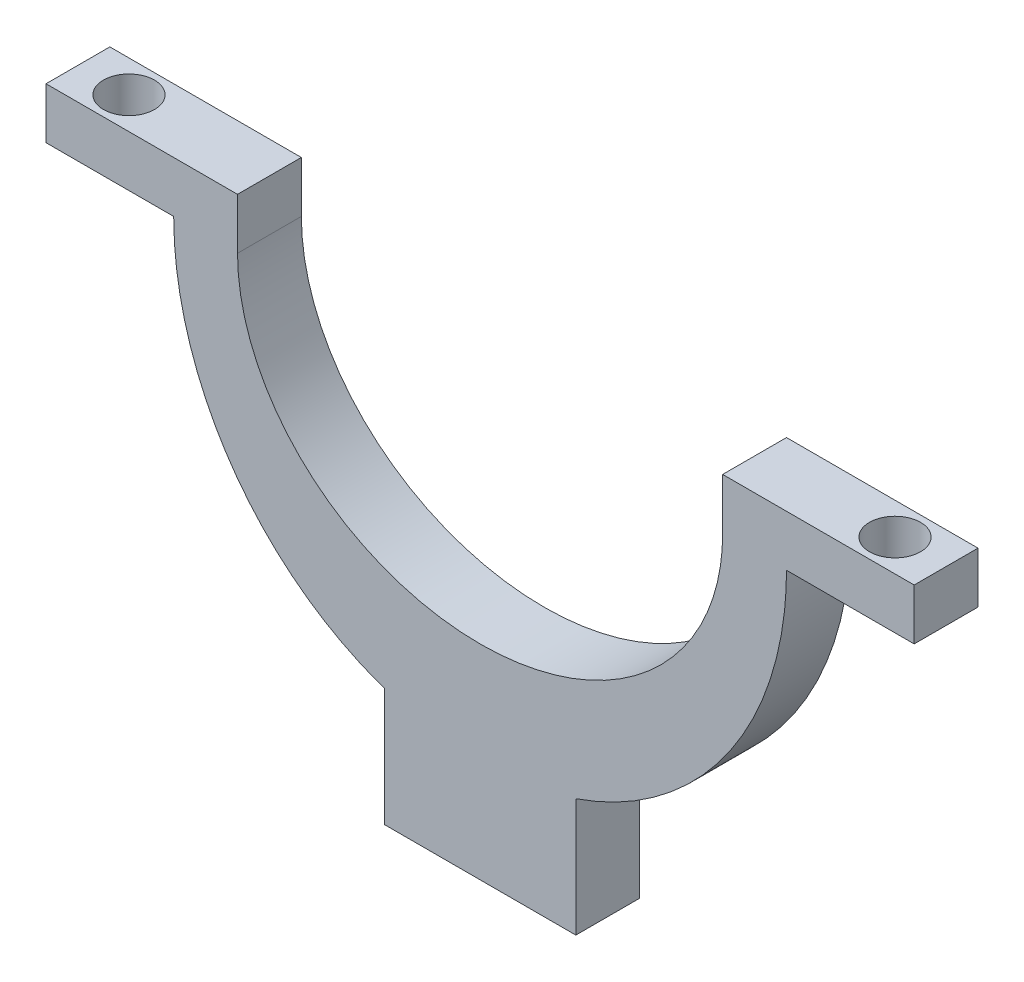
ISO-10303-21;
HEADER;
FILE_DESCRIPTION(('STEP AP214'),'2;1');
FILE_NAME('part.step','',(''),(''),'','','');
FILE_SCHEMA(('AUTOMOTIVE_DESIGN { 1 0 10303 214 1 1 1 1 }'));
ENDSEC;
DATA;
#1=APPLICATION_CONTEXT('core data for automotive mechanical design processes');
#2=APPLICATION_PROTOCOL_DEFINITION('international standard','automotive_design',2000,#1);
#3=PRODUCT_CONTEXT('',#1,'mechanical');
#4=PRODUCT('Part','Part','',(#3));
#5=PRODUCT_RELATED_PRODUCT_CATEGORY('part','',(#4));
#6=PRODUCT_DEFINITION_FORMATION('','',#4);
#7=PRODUCT_DEFINITION_CONTEXT('part definition',#1,'design');
#8=PRODUCT_DEFINITION('design','',#6,#7);
#9=PRODUCT_DEFINITION_SHAPE('','',#8);
#10=(LENGTH_UNIT() NAMED_UNIT(*) SI_UNIT(.MILLI.,.METRE.));
#11=(NAMED_UNIT(*) PLANE_ANGLE_UNIT() SI_UNIT($,.RADIAN.));
#12=(NAMED_UNIT(*) SI_UNIT($,.STERADIAN.) SOLID_ANGLE_UNIT());
#13=UNCERTAINTY_MEASURE_WITH_UNIT(LENGTH_MEASURE(1.E-05),#10,'distance_accuracy_value','');
#14=(GEOMETRIC_REPRESENTATION_CONTEXT(3) GLOBAL_UNCERTAINTY_ASSIGNED_CONTEXT((#13)) GLOBAL_UNIT_ASSIGNED_CONTEXT((#10,
#11,#12)) REPRESENTATION_CONTEXT('',''));
#15=CARTESIAN_POINT('',(0.,0.,0.));
#16=DIRECTION('',(0.,0.,1.));
#17=DIRECTION('',(1.,0.,0.));
#18=AXIS2_PLACEMENT_3D('',#15,#16,#17);
#19=CARTESIAN_POINT('',(0.,0.,5.));
#20=DIRECTION('',(0.,0.,1.));
#21=DIRECTION('',(0.,-1.,0.));
#22=AXIS2_PLACEMENT_3D('',#19,#20,#21);
#23=ELLIPSE('',#22,25.,24.);
#24=DIRECTION('',(0.,0.,-1.));
#25=VECTOR('',#24,1.);
#26=SURFACE_OF_LINEAR_EXTRUSION('',#23,#25);
#27=CARTESIAN_POINT('',(7.5,-23.7479439899542,5.));
#28=VERTEX_POINT('',#27);
#29=CARTESIAN_POINT('',(24.,0.,4.99999999999999));
#30=VERTEX_POINT('',#29);
#31=EDGE_CURVE('E64',#28,#30,#23,.T.);
#32=ORIENTED_EDGE('',*,*,#31,.F.);
#33=DIRECTION('',(0.,0.,-1.));
#34=VECTOR('',#33,1.);
#35=CARTESIAN_POINT('',(7.5,-23.7479439899542,5.));
#36=LINE('',#35,#34);
#37=CARTESIAN_POINT('',(7.5,-23.7479439899542,0.));
#38=VERTEX_POINT('',#37);
#39=EDGE_CURVE('E196',#28,#38,#36,.T.);
#40=ORIENTED_EDGE('',*,*,#39,.T.);
#41=CARTESIAN_POINT('',(0.,0.,0.));
#42=DIRECTION('',(0.,0.,1.));
#43=DIRECTION('',(0.,-1.,0.));
#44=AXIS2_PLACEMENT_3D('',#41,#42,#43);
#45=ELLIPSE('',#44,25.,24.);
#46=CARTESIAN_POINT('',(24.,0.,0.));
#47=VERTEX_POINT('',#46);
#48=EDGE_CURVE('E158',#38,#47,#45,.T.);
#49=ORIENTED_EDGE('',*,*,#48,.T.);
#50=DIRECTION('',(0.,0.,-1.));
#51=VECTOR('',#50,1.);
#52=CARTESIAN_POINT('',(24.,0.,5.));
#53=LINE('',#52,#51);
#54=EDGE_CURVE('E57',#30,#47,#53,.T.);
#55=ORIENTED_EDGE('',*,*,#54,.F.);
#56=EDGE_LOOP('',(#32,#40,#49,#55));
#57=FACE_BOUND('',#56,.T.);
#58=ADVANCED_FACE('F47',(#57),#26,.F.);
#59=CARTESIAN_POINT('',(-24.,0.,0.));
#60=VERTEX_POINT('',#59);
#61=CARTESIAN_POINT('',(-7.5,-23.7479439899542,0.));
#62=VERTEX_POINT('',#61);
#63=EDGE_CURVE('E298',#60,#62,#45,.T.);
#64=ORIENTED_EDGE('',*,*,#63,.T.);
#65=DIRECTION('',(0.,0.,-1.));
#66=VECTOR('',#65,1.);
#67=CARTESIAN_POINT('',(-7.5,-23.7479439899542,5.));
#68=LINE('',#67,#66);
#69=CARTESIAN_POINT('',(-7.5,-23.7479439899542,5.));
#70=VERTEX_POINT('',#69);
#71=EDGE_CURVE('E72',#62,#70,#68,.F.);
#72=ORIENTED_EDGE('',*,*,#71,.T.);
#73=CARTESIAN_POINT('',(-24.,0.,5.));
#74=VERTEX_POINT('',#73);
#75=EDGE_CURVE('E288',#74,#70,#23,.T.);
#76=ORIENTED_EDGE('',*,*,#75,.F.);
#77=DIRECTION('',(0.,0.,-1.));
#78=VECTOR('',#77,1.);
#79=CARTESIAN_POINT('',(-24.,0.,5.));
#80=LINE('',#79,#78);
#81=EDGE_CURVE('E11',#74,#60,#80,.T.);
#82=ORIENTED_EDGE('',*,*,#81,.T.);
#83=EDGE_LOOP('',(#64,#72,#76,#82));
#84=FACE_BOUND('',#83,.T.);
#85=ADVANCED_FACE('F49',(#84),#26,.F.);
#86=CARTESIAN_POINT('',(0.,0.,5.));
#87=DIRECTION('',(0.,0.,1.));
#88=DIRECTION('',(-1.,0.,0.));
#89=AXIS2_PLACEMENT_3D('',#86,#87,#88);
#90=ELLIPSE('',#89,19.,17.);
#91=DIRECTION('',(0.,0.,-1.));
#92=VECTOR('',#91,1.);
#93=SURFACE_OF_LINEAR_EXTRUSION('',#90,#92);
#94=CARTESIAN_POINT('',(0.,0.,0.));
#95=DIRECTION('',(0.,0.,1.));
#96=DIRECTION('',(-1.,0.,0.));
#97=AXIS2_PLACEMENT_3D('',#94,#95,#96);
#98=ELLIPSE('',#97,19.,17.);
#99=CARTESIAN_POINT('',(-19.,0.,0.));
#100=VERTEX_POINT('',#99);
#101=CARTESIAN_POINT('',(19.,0.,0.));
#102=VERTEX_POINT('',#101);
#103=EDGE_CURVE('E367',#100,#102,#98,.T.);
#104=ORIENTED_EDGE('',*,*,#103,.F.);
#105=DIRECTION('',(0.,0.,-1.));
#106=VECTOR('',#105,1.);
#107=CARTESIAN_POINT('',(-19.,0.,5.));
#108=LINE('',#107,#106);
#109=CARTESIAN_POINT('',(-19.,0.,5.));
#110=VERTEX_POINT('',#109);
#111=EDGE_CURVE('E297',#110,#100,#108,.T.);
#112=ORIENTED_EDGE('',*,*,#111,.F.);
#113=CARTESIAN_POINT('',(19.,0.,4.99999999999999));
#114=VERTEX_POINT('',#113);
#115=EDGE_CURVE('E292',#110,#114,#90,.T.);
#116=ORIENTED_EDGE('',*,*,#115,.T.);
#117=DIRECTION('',(0.,0.,-1.));
#118=VECTOR('',#117,1.);
#119=CARTESIAN_POINT('',(19.,0.,5.));
#120=LINE('',#119,#118);
#121=EDGE_CURVE('E386',#114,#102,#120,.T.);
#122=ORIENTED_EDGE('',*,*,#121,.T.);
#123=EDGE_LOOP('',(#104,#112,#116,#122));
#124=FACE_BOUND('',#123,.T.);
#125=ADVANCED_FACE('F300',(#124),#93,.T.);
#126=CARTESIAN_POINT('',(0.,0.,5.));
#127=DIRECTION('',(0.,0.,1.));
#128=DIRECTION('',(1.,0.,0.));
#129=AXIS2_PLACEMENT_3D('',#126,#127,#128);
#130=PLANE('',#129);
#131=ORIENTED_EDGE('',*,*,#75,.T.);
#132=DIRECTION('',(0.,1.,0.));
#133=VECTOR('',#132,1.);
#134=CARTESIAN_POINT('',(-7.5,-33.,5.));
#135=LINE('',#134,#133);
#136=CARTESIAN_POINT('',(-7.5,-33.,5.));
#137=VERTEX_POINT('',#136);
#138=EDGE_CURVE('E188',#137,#70,#135,.T.);
#139=ORIENTED_EDGE('',*,*,#138,.F.);
#140=DIRECTION('',(1.,0.,0.));
#141=VECTOR('',#140,1.);
#142=CARTESIAN_POINT('',(-7.5,-33.,5.));
#143=LINE('',#142,#141);
#144=CARTESIAN_POINT('',(7.5,-33.,5.));
#145=VERTEX_POINT('',#144);
#146=EDGE_CURVE('E163',#137,#145,#143,.T.);
#147=ORIENTED_EDGE('',*,*,#146,.T.);
#148=DIRECTION('',(0.,1.,0.));
#149=VECTOR('',#148,1.);
#150=CARTESIAN_POINT('',(7.5,-33.,5.));
#151=LINE('',#150,#149);
#152=EDGE_CURVE('E178',#145,#28,#151,.T.);
#153=ORIENTED_EDGE('',*,*,#152,.T.);
#154=ORIENTED_EDGE('',*,*,#31,.T.);
#155=DIRECTION('',(1.,0.,0.));
#156=VECTOR('',#155,1.);
#157=CARTESIAN_POINT('',(19.,0.,4.99999999999999));
#158=LINE('',#157,#156);
#159=CARTESIAN_POINT('',(34.,0.,4.99999999999999));
#160=VERTEX_POINT('',#159);
#161=EDGE_CURVE('E235',#30,#160,#158,.T.);
#162=ORIENTED_EDGE('',*,*,#161,.T.);
#163=DIRECTION('',(0.,-1.,0.));
#164=VECTOR('',#163,1.);
#165=CARTESIAN_POINT('',(34.,4.,4.99999999999999));
#166=LINE('',#165,#164);
#167=CARTESIAN_POINT('',(34.,4.,4.99999999999999));
#168=VERTEX_POINT('',#167);
#169=EDGE_CURVE('E257',#168,#160,#166,.T.);
#170=ORIENTED_EDGE('',*,*,#169,.F.);
#171=DIRECTION('',(1.,0.,0.));
#172=VECTOR('',#171,1.);
#173=CARTESIAN_POINT('',(19.,4.,4.99999999999999));
#174=LINE('',#173,#172);
#175=CARTESIAN_POINT('',(19.,4.,4.99999999999999));
#176=VERTEX_POINT('',#175);
#177=EDGE_CURVE('E283',#176,#168,#174,.T.);
#178=ORIENTED_EDGE('',*,*,#177,.F.);
#179=DIRECTION('',(0.,-1.,0.));
#180=VECTOR('',#179,1.);
#181=CARTESIAN_POINT('',(19.,4.,4.99999999999999));
#182=LINE('',#181,#180);
#183=EDGE_CURVE('E215',#176,#114,#182,.T.);
#184=ORIENTED_EDGE('',*,*,#183,.T.);
#185=ORIENTED_EDGE('',*,*,#115,.F.);
#186=DIRECTION('',(0.,-1.,0.));
#187=VECTOR('',#186,1.);
#188=CARTESIAN_POINT('',(-19.,4.,5.));
#189=LINE('',#188,#187);
#190=CARTESIAN_POINT('',(-19.,4.,5.));
#191=VERTEX_POINT('',#190);
#192=EDGE_CURVE('E230',#191,#110,#189,.T.);
#193=ORIENTED_EDGE('',*,*,#192,.F.);
#194=DIRECTION('',(1.,0.,0.));
#195=VECTOR('',#194,1.);
#196=CARTESIAN_POINT('',(-19.,4.,5.));
#197=LINE('',#196,#195);
#198=CARTESIAN_POINT('',(-34.,4.,5.));
#199=VERTEX_POINT('',#198);
#200=EDGE_CURVE('E227',#199,#191,#197,.T.);
#201=ORIENTED_EDGE('',*,*,#200,.F.);
#202=DIRECTION('',(0.,-1.,0.));
#203=VECTOR('',#202,1.);
#204=CARTESIAN_POINT('',(-34.,4.,5.));
#205=LINE('',#204,#203);
#206=CARTESIAN_POINT('',(-34.,0.,5.));
#207=VERTEX_POINT('',#206);
#208=EDGE_CURVE('E243',#199,#207,#205,.T.);
#209=ORIENTED_EDGE('',*,*,#208,.T.);
#210=DIRECTION('',(1.,0.,0.));
#211=VECTOR('',#210,1.);
#212=CARTESIAN_POINT('',(-19.,0.,5.));
#213=LINE('',#212,#211);
#214=EDGE_CURVE('E221',#207,#74,#213,.T.);
#215=ORIENTED_EDGE('',*,*,#214,.T.);
#216=EDGE_LOOP('',(#131,#139,#147,#153,#154,#162,#170,#178,#184,#185,#193,#201,#209,#215));
#217=FACE_BOUND('',#216,.T.);
#218=ADVANCED_FACE('F303',(#217),#130,.T.);
#219=CARTESIAN_POINT('',(0.,0.,0.));
#220=DIRECTION('',(0.,0.,1.));
#221=DIRECTION('',(1.,0.,0.));
#222=AXIS2_PLACEMENT_3D('',#219,#220,#221);
#223=PLANE('',#222);
#224=ORIENTED_EDGE('',*,*,#48,.F.);
#225=DIRECTION('',(0.,1.,0.));
#226=VECTOR('',#225,1.);
#227=CARTESIAN_POINT('',(7.5,-33.,0.));
#228=LINE('',#227,#226);
#229=CARTESIAN_POINT('',(7.5,-33.,0.));
#230=VERTEX_POINT('',#229);
#231=EDGE_CURVE('E152',#230,#38,#228,.T.);
#232=ORIENTED_EDGE('',*,*,#231,.F.);
#233=DIRECTION('',(-1.,0.,0.));
#234=VECTOR('',#233,1.);
#235=CARTESIAN_POINT('',(-7.5,-33.,0.));
#236=LINE('',#235,#234);
#237=CARTESIAN_POINT('',(-7.5,-33.,0.));
#238=VERTEX_POINT('',#237);
#239=EDGE_CURVE('E156',#230,#238,#236,.T.);
#240=ORIENTED_EDGE('',*,*,#239,.T.);
#241=DIRECTION('',(0.,1.,0.));
#242=VECTOR('',#241,1.);
#243=CARTESIAN_POINT('',(-7.5,-33.,0.));
#244=LINE('',#243,#242);
#245=EDGE_CURVE('E162',#238,#62,#244,.T.);
#246=ORIENTED_EDGE('',*,*,#245,.T.);
#247=ORIENTED_EDGE('',*,*,#63,.F.);
#248=DIRECTION('',(-1.,0.,0.));
#249=VECTOR('',#248,1.);
#250=CARTESIAN_POINT('',(-19.,0.,0.));
#251=LINE('',#250,#249);
#252=CARTESIAN_POINT('',(-34.,0.,0.));
#253=VERTEX_POINT('',#252);
#254=EDGE_CURVE('E231',#60,#253,#251,.T.);
#255=ORIENTED_EDGE('',*,*,#254,.T.);
#256=DIRECTION('',(0.,-1.,0.));
#257=VECTOR('',#256,1.);
#258=CARTESIAN_POINT('',(-34.,4.,0.));
#259=LINE('',#258,#257);
#260=CARTESIAN_POINT('',(-34.,4.,0.));
#261=VERTEX_POINT('',#260);
#262=EDGE_CURVE('E247',#261,#253,#259,.T.);
#263=ORIENTED_EDGE('',*,*,#262,.F.);
#264=DIRECTION('',(-1.,0.,0.));
#265=VECTOR('',#264,1.);
#266=CARTESIAN_POINT('',(-19.,4.,0.));
#267=LINE('',#266,#265);
#268=CARTESIAN_POINT('',(-19.,4.,0.));
#269=VERTEX_POINT('',#268);
#270=EDGE_CURVE('E220',#269,#261,#267,.T.);
#271=ORIENTED_EDGE('',*,*,#270,.F.);
#272=DIRECTION('',(0.,-1.,0.));
#273=VECTOR('',#272,1.);
#274=CARTESIAN_POINT('',(-19.,4.,0.));
#275=LINE('',#274,#273);
#276=EDGE_CURVE('E251',#269,#100,#275,.T.);
#277=ORIENTED_EDGE('',*,*,#276,.T.);
#278=ORIENTED_EDGE('',*,*,#103,.T.);
#279=DIRECTION('',(0.,-1.,0.));
#280=VECTOR('',#279,1.);
#281=CARTESIAN_POINT('',(19.,4.,0.));
#282=LINE('',#281,#280);
#283=CARTESIAN_POINT('',(19.,4.,0.));
#284=VERTEX_POINT('',#283);
#285=EDGE_CURVE('E265',#284,#102,#282,.T.);
#286=ORIENTED_EDGE('',*,*,#285,.F.);
#287=DIRECTION('',(-1.,0.,0.));
#288=VECTOR('',#287,1.);
#289=CARTESIAN_POINT('',(19.,4.,0.));
#290=LINE('',#289,#288);
#291=CARTESIAN_POINT('',(34.,4.,0.));
#292=VERTEX_POINT('',#291);
#293=EDGE_CURVE('E268',#292,#284,#290,.T.);
#294=ORIENTED_EDGE('',*,*,#293,.F.);
#295=DIRECTION('',(0.,-1.,0.));
#296=VECTOR('',#295,1.);
#297=CARTESIAN_POINT('',(34.,4.,0.));
#298=LINE('',#297,#296);
#299=CARTESIAN_POINT('',(34.,0.,0.));
#300=VERTEX_POINT('',#299);
#301=EDGE_CURVE('E261',#292,#300,#298,.T.);
#302=ORIENTED_EDGE('',*,*,#301,.T.);
#303=DIRECTION('',(-1.,0.,0.));
#304=VECTOR('',#303,1.);
#305=CARTESIAN_POINT('',(19.,0.,0.));
#306=LINE('',#305,#304);
#307=EDGE_CURVE('E269',#300,#47,#306,.T.);
#308=ORIENTED_EDGE('',*,*,#307,.T.);
#309=EDGE_LOOP('',(#224,#232,#240,#246,#247,#255,#263,#271,#277,#278,#286,#294,#302,#308));
#310=FACE_BOUND('',#309,.T.);
#311=ADVANCED_FACE('F154',(#310),#223,.F.);
#312=CARTESIAN_POINT('',(0.,0.,0.));
#313=DIRECTION('',(0.,1.,0.));
#314=DIRECTION('',(0.,0.,1.));
#315=AXIS2_PLACEMENT_3D('',#312,#313,#314);
#316=PLANE('',#315);
#317=CARTESIAN_POINT('',(30.,0.,2.49999999999999));
#318=DIRECTION('',(0.,1.,0.));
#319=DIRECTION('',(0.,0.,1.));
#320=AXIS2_PLACEMENT_3D('',#317,#318,#319);
#321=CIRCLE('',#320,2.);
#322=CARTESIAN_POINT('',(30.,0.,4.49999999999999));
#323=VERTEX_POINT('',#322);
#324=EDGE_CURVE('E211',#323,#323,#321,.T.);
#325=ORIENTED_EDGE('',*,*,#324,.T.);
#326=EDGE_LOOP('',(#325));
#327=FACE_BOUND('',#326,.T.);
#328=ORIENTED_EDGE('',*,*,#161,.F.);
#329=ORIENTED_EDGE('',*,*,#54,.T.);
#330=ORIENTED_EDGE('',*,*,#307,.F.);
#331=DIRECTION('',(0.,0.,-1.));
#332=VECTOR('',#331,1.);
#333=CARTESIAN_POINT('',(34.,0.,0.));
#334=LINE('',#333,#332);
#335=EDGE_CURVE('E272',#160,#300,#334,.T.);
#336=ORIENTED_EDGE('',*,*,#335,.F.);
#337=EDGE_LOOP('',(#328,#329,#330,#336));
#338=FACE_BOUND('',#337,.T.);
#339=ADVANCED_FACE('F307',(#327,#338),#316,.F.);
#340=CARTESIAN_POINT('',(19.,4.,0.));
#341=DIRECTION('',(1.,0.,0.));
#342=DIRECTION('',(0.,0.,-1.));
#343=AXIS2_PLACEMENT_3D('',#340,#341,#342);
#344=PLANE('',#343);
#345=ORIENTED_EDGE('',*,*,#121,.F.);
#346=ORIENTED_EDGE('',*,*,#183,.F.);
#347=DIRECTION('',(0.,0.,1.));
#348=VECTOR('',#347,1.);
#349=CARTESIAN_POINT('',(19.,4.,0.));
#350=LINE('',#349,#348);
#351=EDGE_CURVE('E273',#284,#176,#350,.T.);
#352=ORIENTED_EDGE('',*,*,#351,.F.);
#353=ORIENTED_EDGE('',*,*,#285,.T.);
#354=EDGE_LOOP('',(#345,#346,#352,#353));
#355=FACE_BOUND('',#354,.T.);
#356=ADVANCED_FACE('F319',(#355),#344,.F.);
#357=CARTESIAN_POINT('',(34.,4.,0.));
#358=DIRECTION('',(-1.,0.,0.));
#359=DIRECTION('',(0.,0.,1.));
#360=AXIS2_PLACEMENT_3D('',#357,#358,#359);
#361=PLANE('',#360);
#362=ORIENTED_EDGE('',*,*,#335,.T.);
#363=ORIENTED_EDGE('',*,*,#301,.F.);
#364=DIRECTION('',(0.,0.,-1.));
#365=VECTOR('',#364,1.);
#366=CARTESIAN_POINT('',(34.,4.,0.));
#367=LINE('',#366,#365);
#368=EDGE_CURVE('E280',#168,#292,#367,.T.);
#369=ORIENTED_EDGE('',*,*,#368,.F.);
#370=ORIENTED_EDGE('',*,*,#169,.T.);
#371=EDGE_LOOP('',(#362,#363,#369,#370));
#372=FACE_BOUND('',#371,.T.);
#373=ADVANCED_FACE('F315',(#372),#361,.F.);
#374=CARTESIAN_POINT('',(0.,4.,0.));
#375=DIRECTION('',(0.,1.,0.));
#376=DIRECTION('',(0.,0.,1.));
#377=AXIS2_PLACEMENT_3D('',#374,#375,#376);
#378=PLANE('',#377);
#379=CARTESIAN_POINT('',(30.,4.,2.49999999999999));
#380=DIRECTION('',(0.,1.,0.));
#381=DIRECTION('',(0.,0.,-1.));
#382=AXIS2_PLACEMENT_3D('',#379,#380,#381);
#383=CIRCLE('',#382,2.);
#384=CARTESIAN_POINT('',(30.,4.,4.49999999999999));
#385=VERTEX_POINT('',#384);
#386=EDGE_CURVE('E199',#385,#385,#383,.T.);
#387=ORIENTED_EDGE('',*,*,#386,.F.);
#388=EDGE_LOOP('',(#387));
#389=FACE_BOUND('',#388,.T.);
#390=ORIENTED_EDGE('',*,*,#351,.T.);
#391=ORIENTED_EDGE('',*,*,#177,.T.);
#392=ORIENTED_EDGE('',*,*,#368,.T.);
#393=ORIENTED_EDGE('',*,*,#293,.T.);
#394=EDGE_LOOP('',(#390,#391,#392,#393));
#395=FACE_BOUND('',#394,.T.);
#396=ADVANCED_FACE('F311',(#389,#395),#378,.T.);
#397=CARTESIAN_POINT('',(0.,0.,0.));
#398=DIRECTION('',(0.,-1.,0.));
#399=DIRECTION('',(0.,0.,-1.));
#400=AXIS2_PLACEMENT_3D('',#397,#398,#399);
#401=PLANE('',#400);
#402=CARTESIAN_POINT('',(-30.,0.,2.5));
#403=DIRECTION('',(0.,-1.,0.));
#404=DIRECTION('',(0.,0.,-1.));
#405=AXIS2_PLACEMENT_3D('',#402,#403,#404);
#406=CIRCLE('',#405,2.);
#407=CARTESIAN_POINT('',(-30.,0.,4.5));
#408=VERTEX_POINT('',#407);
#409=EDGE_CURVE('E204',#408,#408,#406,.T.);
#410=ORIENTED_EDGE('',*,*,#409,.F.);
#411=EDGE_LOOP('',(#410));
#412=FACE_BOUND('',#411,.T.);
#413=ORIENTED_EDGE('',*,*,#81,.F.);
#414=ORIENTED_EDGE('',*,*,#214,.F.);
#415=DIRECTION('',(0.,0.,1.));
#416=VECTOR('',#415,1.);
#417=CARTESIAN_POINT('',(-34.,0.,0.));
#418=LINE('',#417,#416);
#419=EDGE_CURVE('E234',#253,#207,#418,.T.);
#420=ORIENTED_EDGE('',*,*,#419,.F.);
#421=ORIENTED_EDGE('',*,*,#254,.F.);
#422=EDGE_LOOP('',(#413,#414,#420,#421));
#423=FACE_BOUND('',#422,.T.);
#424=ADVANCED_FACE('F314',(#412,#423),#401,.T.);
#425=CARTESIAN_POINT('',(-19.,4.,0.));
#426=DIRECTION('',(-1.,0.,0.));
#427=DIRECTION('',(0.,0.,1.));
#428=AXIS2_PLACEMENT_3D('',#425,#426,#427);
#429=PLANE('',#428);
#430=ORIENTED_EDGE('',*,*,#111,.T.);
#431=ORIENTED_EDGE('',*,*,#276,.F.);
#432=DIRECTION('',(0.,0.,-1.));
#433=VECTOR('',#432,1.);
#434=CARTESIAN_POINT('',(-19.,4.,0.));
#435=LINE('',#434,#433);
#436=EDGE_CURVE('E216',#191,#269,#435,.T.);
#437=ORIENTED_EDGE('',*,*,#436,.F.);
#438=ORIENTED_EDGE('',*,*,#192,.T.);
#439=EDGE_LOOP('',(#430,#431,#437,#438));
#440=FACE_BOUND('',#439,.T.);
#441=ADVANCED_FACE('F327',(#440),#429,.F.);
#442=CARTESIAN_POINT('',(-34.,4.,0.));
#443=DIRECTION('',(1.,0.,0.));
#444=DIRECTION('',(0.,0.,-1.));
#445=AXIS2_PLACEMENT_3D('',#442,#443,#444);
#446=PLANE('',#445);
#447=ORIENTED_EDGE('',*,*,#419,.T.);
#448=ORIENTED_EDGE('',*,*,#208,.F.);
#449=DIRECTION('',(0.,0.,1.));
#450=VECTOR('',#449,1.);
#451=CARTESIAN_POINT('',(-34.,4.,0.));
#452=LINE('',#451,#450);
#453=EDGE_CURVE('E224',#261,#199,#452,.T.);
#454=ORIENTED_EDGE('',*,*,#453,.F.);
#455=ORIENTED_EDGE('',*,*,#262,.T.);
#456=EDGE_LOOP('',(#447,#448,#454,#455));
#457=FACE_BOUND('',#456,.T.);
#458=ADVANCED_FACE('F330',(#457),#446,.F.);
#459=CARTESIAN_POINT('',(0.,4.,0.));
#460=DIRECTION('',(0.,-1.,0.));
#461=DIRECTION('',(0.,0.,-1.));
#462=AXIS2_PLACEMENT_3D('',#459,#460,#461);
#463=PLANE('',#462);
#464=CARTESIAN_POINT('',(-30.,4.,2.5));
#465=DIRECTION('',(0.,1.,0.));
#466=DIRECTION('',(0.,0.,1.));
#467=AXIS2_PLACEMENT_3D('',#464,#465,#466);
#468=CIRCLE('',#467,2.);
#469=CARTESIAN_POINT('',(-30.,4.,4.5));
#470=VERTEX_POINT('',#469);
#471=EDGE_CURVE('E200',#470,#470,#468,.T.);
#472=ORIENTED_EDGE('',*,*,#471,.F.);
#473=EDGE_LOOP('',(#472));
#474=FACE_BOUND('',#473,.T.);
#475=ORIENTED_EDGE('',*,*,#436,.T.);
#476=ORIENTED_EDGE('',*,*,#270,.T.);
#477=ORIENTED_EDGE('',*,*,#453,.T.);
#478=ORIENTED_EDGE('',*,*,#200,.T.);
#479=EDGE_LOOP('',(#475,#476,#477,#478));
#480=FACE_BOUND('',#479,.T.);
#481=ADVANCED_FACE('F334',(#474,#480),#463,.F.);
#482=CARTESIAN_POINT('',(-30.,-25.,2.5));
#483=DIRECTION('',(0.,1.,0.));
#484=DIRECTION('',(0.,0.,1.));
#485=AXIS2_PLACEMENT_3D('',#482,#483,#484);
#486=CYLINDRICAL_SURFACE('',#485,2.);
#487=CARTESIAN_POINT('',(-30.,0.,4.5));
#488=CARTESIAN_POINT('',(-30.,0.0416666666666701,4.5));
#489=CARTESIAN_POINT('',(-30.,0.0833333333333369,4.5));
#490=CARTESIAN_POINT('',(-30.,0.16666666666667,4.5));
#491=CARTESIAN_POINT('',(-30.,0.208333333333337,4.5));
#492=CARTESIAN_POINT('',(-30.,0.29166666666667,4.5));
#493=CARTESIAN_POINT('',(-30.,0.333333333333337,4.5));
#494=CARTESIAN_POINT('',(-30.,0.416666666666671,4.5));
#495=CARTESIAN_POINT('',(-30.,0.458333333333337,4.5));
#496=CARTESIAN_POINT('',(-30.,0.541666666666671,4.5));
#497=CARTESIAN_POINT('',(-30.,0.583333333333337,4.5));
#498=CARTESIAN_POINT('',(-30.,0.666666666666671,4.5));
#499=CARTESIAN_POINT('',(-30.,0.708333333333337,4.5));
#500=CARTESIAN_POINT('',(-30.,0.791666666666671,4.5));
#501=CARTESIAN_POINT('',(-30.,0.833333333333337,4.5));
#502=CARTESIAN_POINT('',(-30.,0.916666666666671,4.5));
#503=CARTESIAN_POINT('',(-30.,0.958333333333338,4.5));
#504=CARTESIAN_POINT('',(-30.,1.04166666666667,4.5));
#505=CARTESIAN_POINT('',(-30.,1.08333333333334,4.5));
#506=CARTESIAN_POINT('',(-30.,1.16666666666667,4.5));
#507=CARTESIAN_POINT('',(-30.,1.20833333333333,4.5));
#508=CARTESIAN_POINT('',(-30.,1.29166666666667,4.5));
#509=CARTESIAN_POINT('',(-30.,1.33333333333333,4.5));
#510=CARTESIAN_POINT('',(-30.,1.41666666666667,4.5));
#511=CARTESIAN_POINT('',(-30.,1.45833333333333,4.5));
#512=CARTESIAN_POINT('',(-30.,1.54166666666667,4.5));
#513=CARTESIAN_POINT('',(-30.,1.58333333333333,4.5));
#514=CARTESIAN_POINT('',(-30.,1.66666666666667,4.5));
#515=CARTESIAN_POINT('',(-30.,1.70833333333333,4.5));
#516=CARTESIAN_POINT('',(-30.,1.79166666666667,4.5));
#517=CARTESIAN_POINT('',(-30.,1.83333333333334,4.5));
#518=CARTESIAN_POINT('',(-30.,1.91666666666667,4.5));
#519=CARTESIAN_POINT('',(-30.,1.95833333333334,4.5));
#520=CARTESIAN_POINT('',(-30.,2.04166666666667,4.5));
#521=CARTESIAN_POINT('',(-30.,2.08333333333334,4.5));
#522=CARTESIAN_POINT('',(-30.,2.16666666666667,4.5));
#523=CARTESIAN_POINT('',(-30.,2.20833333333334,4.5));
#524=CARTESIAN_POINT('',(-30.,2.29166666666667,4.5));
#525=CARTESIAN_POINT('',(-30.,2.33333333333334,4.5));
#526=CARTESIAN_POINT('',(-30.,2.41666666666667,4.5));
#527=CARTESIAN_POINT('',(-30.,2.45833333333334,4.5));
#528=CARTESIAN_POINT('',(-30.,2.54166666666667,4.5));
#529=CARTESIAN_POINT('',(-30.,2.58333333333334,4.5));
#530=CARTESIAN_POINT('',(-30.,2.66666666666667,4.5));
#531=CARTESIAN_POINT('',(-30.,2.70833333333334,4.5));
#532=CARTESIAN_POINT('',(-30.,2.79166666666667,4.5));
#533=CARTESIAN_POINT('',(-30.,2.83333333333333,4.5));
#534=CARTESIAN_POINT('',(-30.,2.91666666666667,4.5));
#535=CARTESIAN_POINT('',(-30.,2.95833333333333,4.5));
#536=CARTESIAN_POINT('',(-30.,3.04166666666667,4.5));
#537=CARTESIAN_POINT('',(-30.,3.08333333333333,4.5));
#538=CARTESIAN_POINT('',(-30.,3.16666666666667,4.5));
#539=CARTESIAN_POINT('',(-30.,3.20833333333333,4.5));
#540=CARTESIAN_POINT('',(-30.,3.29166666666667,4.5));
#541=CARTESIAN_POINT('',(-30.,3.33333333333333,4.5));
#542=CARTESIAN_POINT('',(-30.,3.41666666666667,4.5));
#543=CARTESIAN_POINT('',(-30.,3.45833333333333,4.5));
#544=CARTESIAN_POINT('',(-30.,3.54166666666667,4.5));
#545=CARTESIAN_POINT('',(-30.,3.58333333333333,4.5));
#546=CARTESIAN_POINT('',(-30.,3.66666666666667,4.5));
#547=CARTESIAN_POINT('',(-30.,3.70833333333333,4.5));
#548=CARTESIAN_POINT('',(-30.,3.79166666666667,4.5));
#549=CARTESIAN_POINT('',(-30.,3.83333333333333,4.5));
#550=CARTESIAN_POINT('',(-30.,3.91666666666667,4.5));
#551=CARTESIAN_POINT('',(-30.,3.95833333333333,4.5));
#552=CARTESIAN_POINT('',(-30.,4.,4.5));
#553=B_SPLINE_CURVE_WITH_KNOTS('',3,(#487,#488,#489,#490,#491,#492,#493,#494,#495,#496,#497,
#498,#499,#500,#501,#502,#503,#504,#505,#506,#507,#508,#509,#510,#511,#512,#513,#514,#515,#516,
#517,#518,#519,#520,#521,#522,#523,#524,#525,#526,#527,#528,#529,#530,#531,#532,#533,#534,#535,
#536,#537,#538,#539,#540,#541,#542,#543,#544,#545,#546,#547,#548,#549,#550,#551,#552),
.UNSPECIFIED.,.F.,.F.,(4,2,2,2,2,2,2,2,2,2,2,2,2,2,2,2,2,2,2,2,2,2,2,2,2,2,2,2,2,2,2,2,4),(0.,
0.125,0.25,0.375,0.5,0.625000000000001,0.750000000000001,0.875000000000001,1.,1.125,1.25,1.375,
1.5,1.625,1.75,1.875,2.,2.125,2.25,2.375,2.5,2.625,2.75,2.875,3.,3.125,3.25,3.375,3.5,3.625,
3.75,3.875,4.),.UNSPECIFIED.);
#554=EDGE_CURVE('BSEAM341',#408,#470,#553,.T.);
#555=ORIENTED_EDGE('',*,*,#409,.T.);
#556=ORIENTED_EDGE('',*,*,#471,.T.);
#557=ORIENTED_EDGE('',*,*,#554,.T.);
#558=ORIENTED_EDGE('',*,*,#554,.F.);
#559=EDGE_LOOP('',(#555,#557,#556,#558));
#560=FACE_BOUND('',#559,.T.);
#561=ADVANCED_FACE('F341',(#560),#486,.F.);
#562=CARTESIAN_POINT('',(30.,-25.,2.49999999999999));
#563=DIRECTION('',(0.,1.,0.));
#564=DIRECTION('',(0.,0.,1.));
#565=AXIS2_PLACEMENT_3D('',#562,#563,#564);
#566=CYLINDRICAL_SURFACE('',#565,2.);
#567=CARTESIAN_POINT('',(30.,4.,4.49999999999999));
#568=CARTESIAN_POINT('',(30.,3.95833333333333,4.49999999999999));
#569=CARTESIAN_POINT('',(30.,3.91666666666667,4.49999999999999));
#570=CARTESIAN_POINT('',(30.,3.83333333333333,4.49999999999999));
#571=CARTESIAN_POINT('',(30.,3.79166666666667,4.49999999999999));
#572=CARTESIAN_POINT('',(30.,3.70833333333333,4.49999999999999));
#573=CARTESIAN_POINT('',(30.,3.66666666666667,4.49999999999999));
#574=CARTESIAN_POINT('',(30.,3.58333333333333,4.49999999999999));
#575=CARTESIAN_POINT('',(30.,3.54166666666667,4.49999999999999));
#576=CARTESIAN_POINT('',(30.,3.45833333333333,4.49999999999999));
#577=CARTESIAN_POINT('',(30.,3.41666666666667,4.49999999999999));
#578=CARTESIAN_POINT('',(30.,3.33333333333333,4.49999999999999));
#579=CARTESIAN_POINT('',(30.,3.29166666666667,4.49999999999999));
#580=CARTESIAN_POINT('',(30.,3.20833333333333,4.49999999999999));
#581=CARTESIAN_POINT('',(30.,3.16666666666667,4.49999999999999));
#582=CARTESIAN_POINT('',(30.,3.08333333333333,4.49999999999999));
#583=CARTESIAN_POINT('',(30.,3.04166666666667,4.49999999999999));
#584=CARTESIAN_POINT('',(30.,2.95833333333333,4.49999999999999));
#585=CARTESIAN_POINT('',(30.,2.91666666666667,4.49999999999999));
#586=CARTESIAN_POINT('',(30.,2.83333333333333,4.49999999999999));
#587=CARTESIAN_POINT('',(30.,2.79166666666667,4.49999999999999));
#588=CARTESIAN_POINT('',(30.,2.70833333333333,4.49999999999999));
#589=CARTESIAN_POINT('',(30.,2.66666666666667,4.49999999999999));
#590=CARTESIAN_POINT('',(30.,2.58333333333333,4.49999999999999));
#591=CARTESIAN_POINT('',(30.,2.54166666666667,4.49999999999999));
#592=CARTESIAN_POINT('',(30.,2.45833333333333,4.49999999999999));
#593=CARTESIAN_POINT('',(30.,2.41666666666667,4.49999999999999));
#594=CARTESIAN_POINT('',(30.,2.33333333333333,4.49999999999999));
#595=CARTESIAN_POINT('',(30.,2.29166666666667,4.49999999999999));
#596=CARTESIAN_POINT('',(30.,2.20833333333333,4.49999999999999));
#597=CARTESIAN_POINT('',(30.,2.16666666666667,4.49999999999999));
#598=CARTESIAN_POINT('',(30.,2.08333333333333,4.49999999999999));
#599=CARTESIAN_POINT('',(30.,2.04166666666667,4.49999999999999));
#600=CARTESIAN_POINT('',(30.,1.95833333333333,4.49999999999999));
#601=CARTESIAN_POINT('',(30.,1.91666666666666,4.49999999999999));
#602=CARTESIAN_POINT('',(30.,1.83333333333333,4.49999999999999));
#603=CARTESIAN_POINT('',(30.,1.79166666666666,4.49999999999999));
#604=CARTESIAN_POINT('',(30.,1.70833333333333,4.49999999999999));
#605=CARTESIAN_POINT('',(30.,1.66666666666666,4.49999999999999));
#606=CARTESIAN_POINT('',(30.,1.58333333333333,4.49999999999999));
#607=CARTESIAN_POINT('',(30.,1.54166666666666,4.49999999999999));
#608=CARTESIAN_POINT('',(30.,1.45833333333333,4.49999999999999));
#609=CARTESIAN_POINT('',(30.,1.41666666666666,4.49999999999999));
#610=CARTESIAN_POINT('',(30.,1.33333333333333,4.49999999999999));
#611=CARTESIAN_POINT('',(30.,1.29166666666666,4.49999999999999));
#612=CARTESIAN_POINT('',(30.,1.20833333333333,4.49999999999999));
#613=CARTESIAN_POINT('',(30.,1.16666666666666,4.49999999999999));
#614=CARTESIAN_POINT('',(30.,1.08333333333333,4.49999999999999));
#615=CARTESIAN_POINT('',(30.,1.04166666666666,4.49999999999999));
#616=CARTESIAN_POINT('',(30.,0.958333333333331,4.49999999999999));
#617=CARTESIAN_POINT('',(30.,0.916666666666664,4.49999999999999));
#618=CARTESIAN_POINT('',(30.,0.833333333333331,4.49999999999999));
#619=CARTESIAN_POINT('',(30.,0.791666666666664,4.49999999999999));
#620=CARTESIAN_POINT('',(30.,0.70833333333333,4.49999999999999));
#621=CARTESIAN_POINT('',(30.,0.666666666666664,4.49999999999999));
#622=CARTESIAN_POINT('',(30.,0.58333333333333,4.49999999999999));
#623=CARTESIAN_POINT('',(30.,0.541666666666664,4.49999999999999));
#624=CARTESIAN_POINT('',(30.,0.45833333333333,4.49999999999999));
#625=CARTESIAN_POINT('',(30.,0.416666666666664,4.49999999999999));
#626=CARTESIAN_POINT('',(30.,0.33333333333333,4.49999999999999));
#627=CARTESIAN_POINT('',(30.,0.291666666666663,4.49999999999999));
#628=CARTESIAN_POINT('',(30.,0.20833333333333,4.49999999999999));
#629=CARTESIAN_POINT('',(30.,0.166666666666663,4.49999999999999));
#630=CARTESIAN_POINT('',(30.,0.0833333333333299,4.49999999999999));
#631=CARTESIAN_POINT('',(30.,0.0416666666666632,4.49999999999999));
#632=CARTESIAN_POINT('',(30.,0.,4.49999999999999));
#633=B_SPLINE_CURVE_WITH_KNOTS('',3,(#567,#568,#569,#570,#571,#572,#573,#574,#575,#576,#577,
#578,#579,#580,#581,#582,#583,#584,#585,#586,#587,#588,#589,#590,#591,#592,#593,#594,#595,#596,
#597,#598,#599,#600,#601,#602,#603,#604,#605,#606,#607,#608,#609,#610,#611,#612,#613,#614,#615,
#616,#617,#618,#619,#620,#621,#622,#623,#624,#625,#626,#627,#628,#629,#630,#631,#632),
.UNSPECIFIED.,.F.,.F.,(4,2,2,2,2,2,2,2,2,2,2,2,2,2,2,2,2,2,2,2,2,2,2,2,2,2,2,2,2,2,2,2,4),(0.,
0.125,0.25,0.375,0.5,0.625000000000001,0.750000000000001,0.875000000000001,1.,1.125,1.25,1.375,
1.5,1.625,1.75,1.875,2.,2.125,2.25,2.375,2.5,2.625,2.75,2.875,3.,3.125,3.25,3.375,3.5,3.625,
3.75,3.875,4.),.UNSPECIFIED.);
#634=EDGE_CURVE('BSEAM343',#385,#323,#633,.T.);
#635=ORIENTED_EDGE('',*,*,#386,.T.);
#636=ORIENTED_EDGE('',*,*,#324,.F.);
#637=ORIENTED_EDGE('',*,*,#634,.T.);
#638=ORIENTED_EDGE('',*,*,#634,.F.);
#639=EDGE_LOOP('',(#635,#637,#636,#638));
#640=FACE_BOUND('',#639,.T.);
#641=ADVANCED_FACE('F343',(#640),#566,.F.);
#642=CARTESIAN_POINT('',(7.5,-33.,0.));
#643=DIRECTION('',(1.,0.,0.));
#644=DIRECTION('',(0.,0.,-1.));
#645=AXIS2_PLACEMENT_3D('',#642,#643,#644);
#646=PLANE('',#645);
#647=ORIENTED_EDGE('',*,*,#39,.F.);
#648=ORIENTED_EDGE('',*,*,#152,.F.);
#649=DIRECTION('',(0.,0.,-1.));
#650=VECTOR('',#649,1.);
#651=CARTESIAN_POINT('',(7.5,-33.,0.));
#652=LINE('',#651,#650);
#653=EDGE_CURVE('E170',#145,#230,#652,.T.);
#654=ORIENTED_EDGE('',*,*,#653,.T.);
#655=ORIENTED_EDGE('',*,*,#231,.T.);
#656=EDGE_LOOP('',(#647,#648,#654,#655));
#657=FACE_BOUND('',#656,.T.);
#658=ADVANCED_FACE('F176',(#657),#646,.T.);
#659=CARTESIAN_POINT('',(-7.5,-33.,0.));
#660=DIRECTION('',(-1.,0.,0.));
#661=DIRECTION('',(0.,0.,1.));
#662=AXIS2_PLACEMENT_3D('',#659,#660,#661);
#663=PLANE('',#662);
#664=ORIENTED_EDGE('',*,*,#71,.F.);
#665=ORIENTED_EDGE('',*,*,#245,.F.);
#666=DIRECTION('',(0.,0.,1.));
#667=VECTOR('',#666,1.);
#668=CARTESIAN_POINT('',(-7.5,-33.,0.));
#669=LINE('',#668,#667);
#670=EDGE_CURVE('E173',#238,#137,#669,.T.);
#671=ORIENTED_EDGE('',*,*,#670,.T.);
#672=ORIENTED_EDGE('',*,*,#138,.T.);
#673=EDGE_LOOP('',(#664,#665,#671,#672));
#674=FACE_BOUND('',#673,.T.);
#675=ADVANCED_FACE('F352',(#674),#663,.T.);
#676=CARTESIAN_POINT('',(0.,-33.,0.));
#677=DIRECTION('',(0.,1.,0.));
#678=DIRECTION('',(0.,0.,1.));
#679=AXIS2_PLACEMENT_3D('',#676,#677,#678);
#680=PLANE('',#679);
#681=ORIENTED_EDGE('',*,*,#653,.F.);
#682=ORIENTED_EDGE('',*,*,#146,.F.);
#683=ORIENTED_EDGE('',*,*,#670,.F.);
#684=ORIENTED_EDGE('',*,*,#239,.F.);
#685=EDGE_LOOP('',(#681,#682,#683,#684));
#686=FACE_BOUND('',#685,.T.);
#687=ADVANCED_FACE('F168',(#686),#680,.F.);
#688=CLOSED_SHELL('',(#58,#85,#125,#218,#311,#339,#356,#373,#396,#424,#441,#458,#481,#561,#641,
#658,#675,#687));
#689=MANIFOLD_SOLID_BREP('B2',#688);
#690=ADVANCED_BREP_SHAPE_REPRESENTATION('',(#18,#689),#14);
#691=SHAPE_DEFINITION_REPRESENTATION(#9,#690);
ENDSEC;
END-ISO-10303-21;
